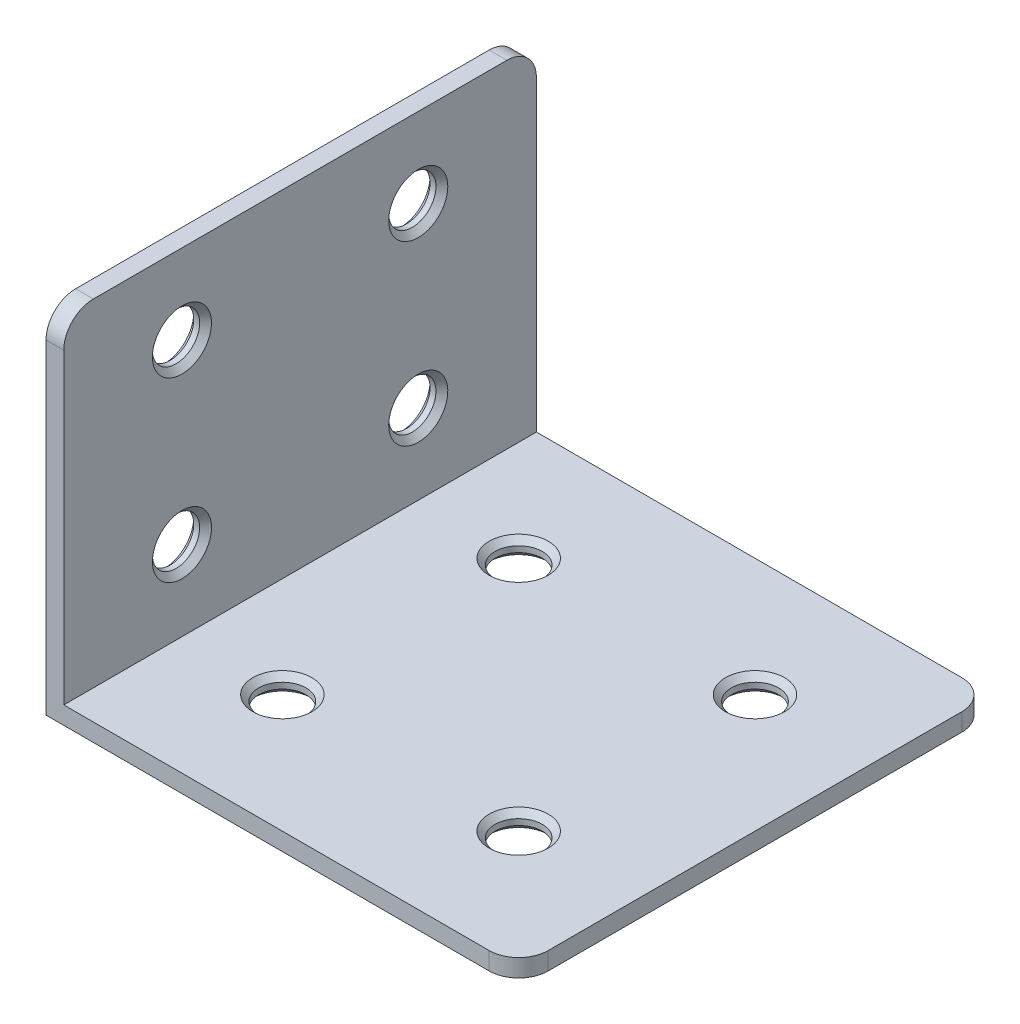
ISO-10303-21;
HEADER;
FILE_DESCRIPTION(('STEP AP214'),'2;1');
FILE_NAME('part.step','',(''),(''),'','','');
FILE_SCHEMA(('AUTOMOTIVE_DESIGN { 1 0 10303 214 1 1 1 1 }'));
ENDSEC;
DATA;
#1=APPLICATION_CONTEXT('core data for automotive mechanical design processes');
#2=APPLICATION_PROTOCOL_DEFINITION('international standard','automotive_design',2000,#1);
#3=PRODUCT_CONTEXT('',#1,'mechanical');
#4=PRODUCT('Part','Part','',(#3));
#5=PRODUCT_RELATED_PRODUCT_CATEGORY('part','',(#4));
#6=PRODUCT_DEFINITION_FORMATION('','',#4);
#7=PRODUCT_DEFINITION_CONTEXT('part definition',#1,'design');
#8=PRODUCT_DEFINITION('design','',#6,#7);
#9=PRODUCT_DEFINITION_SHAPE('','',#8);
#10=(LENGTH_UNIT() NAMED_UNIT(*) SI_UNIT(.MILLI.,.METRE.));
#11=(NAMED_UNIT(*) PLANE_ANGLE_UNIT() SI_UNIT($,.RADIAN.));
#12=(NAMED_UNIT(*) SI_UNIT($,.STERADIAN.) SOLID_ANGLE_UNIT());
#13=UNCERTAINTY_MEASURE_WITH_UNIT(LENGTH_MEASURE(1.E-05),#10,'distance_accuracy_value','');
#14=(GEOMETRIC_REPRESENTATION_CONTEXT(3) GLOBAL_UNCERTAINTY_ASSIGNED_CONTEXT((#13)) GLOBAL_UNIT_ASSIGNED_CONTEXT((#10,
#11,#12)) REPRESENTATION_CONTEXT('',''));
#15=CARTESIAN_POINT('',(0.,0.,0.));
#16=DIRECTION('',(0.,0.,1.));
#17=DIRECTION('',(1.,0.,0.));
#18=AXIS2_PLACEMENT_3D('',#15,#16,#17);
#19=CARTESIAN_POINT('',(0.,0.,0.));
#20=DIRECTION('',(0.,-1.,0.));
#21=DIRECTION('',(0.,0.,-1.));
#22=AXIS2_PLACEMENT_3D('',#19,#20,#21);
#23=PLANE('',#22);
#24=CARTESIAN_POINT('',(-20.,0.,-20.));
#25=DIRECTION('',(0.,-1.,0.));
#26=DIRECTION('',(0.,0.,-1.));
#27=AXIS2_PLACEMENT_3D('',#24,#25,#26);
#28=CIRCLE('',#27,5.);
#29=CARTESIAN_POINT('',(-20.,0.,-25.));
#30=VERTEX_POINT('',#29);
#31=EDGE_CURVE('E329',#30,#30,#28,.F.);
#32=ORIENTED_EDGE('',*,*,#31,.T.);
#33=EDGE_LOOP('',(#32));
#34=FACE_BOUND('',#33,.T.);
#35=CARTESIAN_POINT('',(20.,0.,20.));
#36=DIRECTION('',(0.,-1.,0.));
#37=DIRECTION('',(0.,0.,-1.));
#38=AXIS2_PLACEMENT_3D('',#35,#36,#37);
#39=CIRCLE('',#38,5.);
#40=CARTESIAN_POINT('',(20.,0.,15.));
#41=VERTEX_POINT('',#40);
#42=EDGE_CURVE('E325',#41,#41,#39,.F.);
#43=ORIENTED_EDGE('',*,*,#42,.T.);
#44=EDGE_LOOP('',(#43));
#45=FACE_BOUND('',#44,.T.);
#46=CARTESIAN_POINT('',(20.,0.,-20.));
#47=DIRECTION('',(0.,-1.,0.));
#48=DIRECTION('',(0.,0.,-1.));
#49=AXIS2_PLACEMENT_3D('',#46,#47,#48);
#50=CIRCLE('',#49,4.99999999999999);
#51=CARTESIAN_POINT('',(20.,0.,-25.));
#52=VERTEX_POINT('',#51);
#53=EDGE_CURVE('E321',#52,#52,#50,.F.);
#54=ORIENTED_EDGE('',*,*,#53,.T.);
#55=EDGE_LOOP('',(#54));
#56=FACE_BOUND('',#55,.T.);
#57=CARTESIAN_POINT('',(-20.,0.,20.));
#58=DIRECTION('',(0.,-1.,0.));
#59=DIRECTION('',(0.,0.,-1.));
#60=AXIS2_PLACEMENT_3D('',#57,#58,#59);
#61=CIRCLE('',#60,5.00000000000001);
#62=CARTESIAN_POINT('',(-20.,0.,15.));
#63=VERTEX_POINT('',#62);
#64=EDGE_CURVE('E317',#63,#63,#61,.F.);
#65=ORIENTED_EDGE('',*,*,#64,.T.);
#66=EDGE_LOOP('',(#65));
#67=FACE_BOUND('',#66,.T.);
#68=DIRECTION('',(0.,0.,-1.));
#69=VECTOR('',#68,1.);
#70=CARTESIAN_POINT('',(40.,0.,40.));
#71=LINE('',#70,#69);
#72=CARTESIAN_POINT('',(40.,0.,35.));
#73=VERTEX_POINT('',#72);
#74=CARTESIAN_POINT('',(40.,0.,-35.));
#75=VERTEX_POINT('',#74);
#76=EDGE_CURVE('E165',#73,#75,#71,.T.);
#77=ORIENTED_EDGE('',*,*,#76,.F.);
#78=CARTESIAN_POINT('',(35.,0.,35.));
#79=DIRECTION('',(0.,-1.,0.));
#80=DIRECTION('',(0.,0.,-1.));
#81=AXIS2_PLACEMENT_3D('',#78,#79,#80);
#82=CIRCLE('',#81,5.);
#83=CARTESIAN_POINT('',(35.,0.,40.));
#84=VERTEX_POINT('',#83);
#85=EDGE_CURVE('E201',#73,#84,#82,.T.);
#86=ORIENTED_EDGE('',*,*,#85,.T.);
#87=DIRECTION('',(1.,0.,0.));
#88=VECTOR('',#87,1.);
#89=CARTESIAN_POINT('',(-40.,0.,40.));
#90=LINE('',#89,#88);
#91=CARTESIAN_POINT('',(-40.,0.,40.));
#92=VERTEX_POINT('',#91);
#93=EDGE_CURVE('E171',#92,#84,#90,.T.);
#94=ORIENTED_EDGE('',*,*,#93,.F.);
#95=DIRECTION('',(0.,0.,1.));
#96=VECTOR('',#95,1.);
#97=CARTESIAN_POINT('',(-40.,0.,40.));
#98=LINE('',#97,#96);
#99=CARTESIAN_POINT('',(-40.,0.,-40.));
#100=VERTEX_POINT('',#99);
#101=EDGE_CURVE('E179',#100,#92,#98,.T.);
#102=ORIENTED_EDGE('',*,*,#101,.F.);
#103=DIRECTION('',(-1.,0.,0.));
#104=VECTOR('',#103,1.);
#105=CARTESIAN_POINT('',(-40.,0.,-40.));
#106=LINE('',#105,#104);
#107=CARTESIAN_POINT('',(35.,0.,-40.));
#108=VERTEX_POINT('',#107);
#109=EDGE_CURVE('E175',#108,#100,#106,.T.);
#110=ORIENTED_EDGE('',*,*,#109,.F.);
#111=CARTESIAN_POINT('',(35.,0.,-35.));
#112=DIRECTION('',(0.,-1.,0.));
#113=DIRECTION('',(0.,0.,-1.));
#114=AXIS2_PLACEMENT_3D('',#111,#112,#113);
#115=CIRCLE('',#114,5.);
#116=EDGE_CURVE('E198',#108,#75,#115,.T.);
#117=ORIENTED_EDGE('',*,*,#116,.T.);
#118=EDGE_LOOP('',(#77,#86,#94,#102,#110,#117));
#119=FACE_BOUND('',#118,.T.);
#120=ADVANCED_FACE('F41',(#34,#45,#56,#67,#119),#23,.T.);
#121=CARTESIAN_POINT('',(40.,3.,-40.));
#122=DIRECTION('',(0.,-1.,0.));
#123=DIRECTION('',(1.,0.,0.));
#124=AXIS2_PLACEMENT_3D('',#121,#122,#123);
#125=PLANE('',#124);
#126=CARTESIAN_POINT('',(-20.,2.99999999999999,-20.));
#127=DIRECTION('',(0.,-1.,0.));
#128=DIRECTION('',(1.,0.,0.));
#129=AXIS2_PLACEMENT_3D('',#126,#127,#128);
#130=CIRCLE('',#129,5.00000000000001);
#131=CARTESIAN_POINT('',(-15.,2.99999999999999,-20.));
#132=VERTEX_POINT('',#131);
#133=EDGE_CURVE('E313',#132,#132,#130,.T.);
#134=ORIENTED_EDGE('',*,*,#133,.T.);
#135=EDGE_LOOP('',(#134));
#136=FACE_BOUND('',#135,.T.);
#137=CARTESIAN_POINT('',(20.,3.,-20.));
#138=DIRECTION('',(0.,-1.,0.));
#139=DIRECTION('',(1.,0.,0.));
#140=AXIS2_PLACEMENT_3D('',#137,#138,#139);
#141=CIRCLE('',#140,5.00000000000002);
#142=CARTESIAN_POINT('',(25.,3.,-20.));
#143=VERTEX_POINT('',#142);
#144=EDGE_CURVE('E309',#143,#143,#141,.T.);
#145=ORIENTED_EDGE('',*,*,#144,.T.);
#146=EDGE_LOOP('',(#145));
#147=FACE_BOUND('',#146,.T.);
#148=CARTESIAN_POINT('',(20.,3.,20.));
#149=DIRECTION('',(0.,-1.,0.));
#150=DIRECTION('',(1.,0.,0.));
#151=AXIS2_PLACEMENT_3D('',#148,#149,#150);
#152=CIRCLE('',#151,5.00000000000001);
#153=CARTESIAN_POINT('',(25.,3.,20.));
#154=VERTEX_POINT('',#153);
#155=EDGE_CURVE('E305',#154,#154,#152,.T.);
#156=ORIENTED_EDGE('',*,*,#155,.T.);
#157=EDGE_LOOP('',(#156));
#158=FACE_BOUND('',#157,.T.);
#159=CARTESIAN_POINT('',(-20.,2.99999999999999,20.));
#160=DIRECTION('',(0.,-1.,0.));
#161=DIRECTION('',(1.,0.,0.));
#162=AXIS2_PLACEMENT_3D('',#159,#160,#161);
#163=CIRCLE('',#162,5.00000000000002);
#164=CARTESIAN_POINT('',(-15.,2.99999999999999,20.));
#165=VERTEX_POINT('',#164);
#166=EDGE_CURVE('E301',#165,#165,#163,.T.);
#167=ORIENTED_EDGE('',*,*,#166,.T.);
#168=EDGE_LOOP('',(#167));
#169=FACE_BOUND('',#168,.T.);
#170=DIRECTION('',(1.,0.,0.));
#171=VECTOR('',#170,1.);
#172=CARTESIAN_POINT('',(40.,3.,40.));
#173=LINE('',#172,#171);
#174=CARTESIAN_POINT('',(-37.,2.99999999999999,40.));
#175=VERTEX_POINT('',#174);
#176=CARTESIAN_POINT('',(35.,3.,40.));
#177=VERTEX_POINT('',#176);
#178=EDGE_CURVE('E135',#175,#177,#173,.T.);
#179=ORIENTED_EDGE('',*,*,#178,.T.);
#180=CARTESIAN_POINT('',(35.,3.,35.));
#181=DIRECTION('',(0.,-1.,0.));
#182=DIRECTION('',(1.,0.,0.));
#183=AXIS2_PLACEMENT_3D('',#180,#181,#182);
#184=CIRCLE('',#183,5.);
#185=CARTESIAN_POINT('',(40.,3.,35.));
#186=VERTEX_POINT('',#185);
#187=EDGE_CURVE('E212',#177,#186,#184,.F.);
#188=ORIENTED_EDGE('',*,*,#187,.T.);
#189=DIRECTION('',(0.,0.,1.));
#190=VECTOR('',#189,1.);
#191=CARTESIAN_POINT('',(40.,3.,-40.));
#192=LINE('',#191,#190);
#193=CARTESIAN_POINT('',(40.,3.,-35.));
#194=VERTEX_POINT('',#193);
#195=EDGE_CURVE('E146',#194,#186,#192,.T.);
#196=ORIENTED_EDGE('',*,*,#195,.F.);
#197=CARTESIAN_POINT('',(35.,3.,-35.));
#198=DIRECTION('',(0.,-1.,0.));
#199=DIRECTION('',(1.,0.,0.));
#200=AXIS2_PLACEMENT_3D('',#197,#198,#199);
#201=CIRCLE('',#200,5.);
#202=CARTESIAN_POINT('',(35.,3.,-40.));
#203=VERTEX_POINT('',#202);
#204=EDGE_CURVE('E152',#194,#203,#201,.F.);
#205=ORIENTED_EDGE('',*,*,#204,.T.);
#206=DIRECTION('',(1.,0.,0.));
#207=VECTOR('',#206,1.);
#208=CARTESIAN_POINT('',(40.,3.,-40.));
#209=LINE('',#208,#207);
#210=CARTESIAN_POINT('',(-37.,2.99999999999999,-40.));
#211=VERTEX_POINT('',#210);
#212=EDGE_CURVE('E128',#211,#203,#209,.T.);
#213=ORIENTED_EDGE('',*,*,#212,.F.);
#214=DIRECTION('',(0.,0.,1.));
#215=VECTOR('',#214,1.);
#216=CARTESIAN_POINT('',(-37.,2.99999999999999,-40.));
#217=LINE('',#216,#215);
#218=EDGE_CURVE('E138',#211,#175,#217,.T.);
#219=ORIENTED_EDGE('',*,*,#218,.T.);
#220=EDGE_LOOP('',(#179,#188,#196,#205,#213,#219));
#221=FACE_BOUND('',#220,.T.);
#222=ADVANCED_FACE('F149',(#136,#147,#158,#169,#221),#125,.F.);
#223=CARTESIAN_POINT('',(40.,60.,40.));
#224=DIRECTION('',(-1.,0.,0.));
#225=DIRECTION('',(0.,0.,1.));
#226=AXIS2_PLACEMENT_3D('',#223,#224,#225);
#227=PLANE('',#226);
#228=ORIENTED_EDGE('',*,*,#195,.T.);
#229=DIRECTION('',(0.,-1.,0.));
#230=VECTOR('',#229,1.);
#231=CARTESIAN_POINT('',(40.,60.,35.));
#232=LINE('',#231,#230);
#233=EDGE_CURVE('E194',#186,#73,#232,.T.);
#234=ORIENTED_EDGE('',*,*,#233,.T.);
#235=ORIENTED_EDGE('',*,*,#76,.T.);
#236=DIRECTION('',(0.,-1.,0.));
#237=VECTOR('',#236,1.);
#238=CARTESIAN_POINT('',(40.,60.,-35.));
#239=LINE('',#238,#237);
#240=EDGE_CURVE('E191',#75,#194,#239,.F.);
#241=ORIENTED_EDGE('',*,*,#240,.T.);
#242=EDGE_LOOP('',(#228,#234,#235,#241));
#243=FACE_BOUND('',#242,.T.);
#244=ADVANCED_FACE('F390',(#243),#227,.F.);
#245=CARTESIAN_POINT('',(-40.,60.,-40.));
#246=DIRECTION('',(0.,0.,1.));
#247=DIRECTION('',(1.,0.,0.));
#248=AXIS2_PLACEMENT_3D('',#245,#246,#247);
#249=PLANE('',#248);
#250=ORIENTED_EDGE('',*,*,#212,.T.);
#251=DIRECTION('',(0.,-1.,0.));
#252=VECTOR('',#251,1.);
#253=CARTESIAN_POINT('',(35.,60.,-40.));
#254=LINE('',#253,#252);
#255=EDGE_CURVE('E217',#203,#108,#254,.T.);
#256=ORIENTED_EDGE('',*,*,#255,.T.);
#257=ORIENTED_EDGE('',*,*,#109,.T.);
#258=DIRECTION('',(0.,-1.,0.));
#259=VECTOR('',#258,1.);
#260=CARTESIAN_POINT('',(-40.,60.,-40.));
#261=LINE('',#260,#259);
#262=CARTESIAN_POINT('',(-40.,55.,-40.));
#263=VERTEX_POINT('',#262);
#264=EDGE_CURVE('E188',#263,#100,#261,.T.);
#265=ORIENTED_EDGE('',*,*,#264,.F.);
#266=DIRECTION('',(-1.,0.,0.));
#267=VECTOR('',#266,1.);
#268=CARTESIAN_POINT('',(-40.,55.,-40.));
#269=LINE('',#268,#267);
#270=CARTESIAN_POINT('',(-37.,55.,-40.));
#271=VERTEX_POINT('',#270);
#272=EDGE_CURVE('E131',#263,#271,#269,.F.);
#273=ORIENTED_EDGE('',*,*,#272,.T.);
#274=DIRECTION('',(0.,-1.,0.));
#275=VECTOR('',#274,1.);
#276=CARTESIAN_POINT('',(-37.,60.,-40.));
#277=LINE('',#276,#275);
#278=EDGE_CURVE('E123',#271,#211,#277,.T.);
#279=ORIENTED_EDGE('',*,*,#278,.T.);
#280=EDGE_LOOP('',(#250,#256,#257,#265,#273,#279));
#281=FACE_BOUND('',#280,.T.);
#282=ADVANCED_FACE('F125',(#281),#249,.F.);
#283=CARTESIAN_POINT('',(-40.,60.,40.));
#284=DIRECTION('',(1.,0.,0.));
#285=DIRECTION('',(0.,0.,-1.));
#286=AXIS2_PLACEMENT_3D('',#283,#284,#285);
#287=PLANE('',#286);
#288=CARTESIAN_POINT('',(-40.,16.5,20.));
#289=DIRECTION('',(1.,0.,0.));
#290=DIRECTION('',(0.,0.,-1.));
#291=AXIS2_PLACEMENT_3D('',#288,#289,#290);
#292=CIRCLE('',#291,5.);
#293=CARTESIAN_POINT('',(-40.,16.5,15.));
#294=VERTEX_POINT('',#293);
#295=EDGE_CURVE('E249',#294,#294,#292,.T.);
#296=ORIENTED_EDGE('',*,*,#295,.T.);
#297=EDGE_LOOP('',(#296));
#298=FACE_BOUND('',#297,.T.);
#299=CARTESIAN_POINT('',(-40.,46.5,20.));
#300=DIRECTION('',(1.,0.,0.));
#301=DIRECTION('',(0.,0.,-1.));
#302=AXIS2_PLACEMENT_3D('',#299,#300,#301);
#303=CIRCLE('',#302,5.);
#304=CARTESIAN_POINT('',(-40.,46.5,15.));
#305=VERTEX_POINT('',#304);
#306=EDGE_CURVE('E245',#305,#305,#303,.T.);
#307=ORIENTED_EDGE('',*,*,#306,.T.);
#308=EDGE_LOOP('',(#307));
#309=FACE_BOUND('',#308,.T.);
#310=CARTESIAN_POINT('',(-40.,46.5,-20.));
#311=DIRECTION('',(1.,0.,0.));
#312=DIRECTION('',(0.,0.,-1.));
#313=AXIS2_PLACEMENT_3D('',#310,#311,#312);
#314=CIRCLE('',#313,5.);
#315=CARTESIAN_POINT('',(-40.,46.5,-25.));
#316=VERTEX_POINT('',#315);
#317=EDGE_CURVE('E241',#316,#316,#314,.T.);
#318=ORIENTED_EDGE('',*,*,#317,.T.);
#319=EDGE_LOOP('',(#318));
#320=FACE_BOUND('',#319,.T.);
#321=CARTESIAN_POINT('',(-40.,16.5,-20.));
#322=DIRECTION('',(1.,0.,0.));
#323=DIRECTION('',(0.,0.,-1.));
#324=AXIS2_PLACEMENT_3D('',#321,#322,#323);
#325=CIRCLE('',#324,5.);
#326=CARTESIAN_POINT('',(-40.,16.5,-25.));
#327=VERTEX_POINT('',#326);
#328=EDGE_CURVE('E237',#327,#327,#325,.T.);
#329=ORIENTED_EDGE('',*,*,#328,.T.);
#330=EDGE_LOOP('',(#329));
#331=FACE_BOUND('',#330,.T.);
#332=DIRECTION('',(0.,0.,1.));
#333=VECTOR('',#332,1.);
#334=CARTESIAN_POINT('',(-40.,60.,40.));
#335=LINE('',#334,#333);
#336=CARTESIAN_POINT('',(-40.,60.,-35.));
#337=VERTEX_POINT('',#336);
#338=CARTESIAN_POINT('',(-40.,60.,35.));
#339=VERTEX_POINT('',#338);
#340=EDGE_CURVE('E167',#337,#339,#335,.T.);
#341=ORIENTED_EDGE('',*,*,#340,.F.);
#342=CARTESIAN_POINT('',(-40.,55.,-35.));
#343=DIRECTION('',(1.,0.,0.));
#344=DIRECTION('',(0.,0.,-1.));
#345=AXIS2_PLACEMENT_3D('',#342,#343,#344);
#346=CIRCLE('',#345,5.);
#347=EDGE_CURVE('E66',#337,#263,#346,.F.);
#348=ORIENTED_EDGE('',*,*,#347,.T.);
#349=ORIENTED_EDGE('',*,*,#264,.T.);
#350=ORIENTED_EDGE('',*,*,#101,.T.);
#351=DIRECTION('',(0.,-1.,0.));
#352=VECTOR('',#351,1.);
#353=CARTESIAN_POINT('',(-40.,60.,40.));
#354=LINE('',#353,#352);
#355=CARTESIAN_POINT('',(-40.,55.,40.));
#356=VERTEX_POINT('',#355);
#357=EDGE_CURVE('E170',#356,#92,#354,.T.);
#358=ORIENTED_EDGE('',*,*,#357,.F.);
#359=CARTESIAN_POINT('',(-40.,55.,35.));
#360=DIRECTION('',(1.,0.,0.));
#361=DIRECTION('',(0.,0.,-1.));
#362=AXIS2_PLACEMENT_3D('',#359,#360,#361);
#363=CIRCLE('',#362,5.);
#364=EDGE_CURVE('E58',#356,#339,#363,.F.);
#365=ORIENTED_EDGE('',*,*,#364,.T.);
#366=EDGE_LOOP('',(#341,#348,#349,#350,#358,#365));
#367=FACE_BOUND('',#366,.T.);
#368=ADVANCED_FACE('F370',(#298,#309,#320,#331,#367),#287,.F.);
#369=CARTESIAN_POINT('',(-40.,60.,40.));
#370=DIRECTION('',(0.,0.,-1.));
#371=DIRECTION('',(-1.,0.,0.));
#372=AXIS2_PLACEMENT_3D('',#369,#370,#371);
#373=PLANE('',#372);
#374=ORIENTED_EDGE('',*,*,#93,.T.);
#375=DIRECTION('',(0.,-1.,0.));
#376=VECTOR('',#375,1.);
#377=CARTESIAN_POINT('',(35.,60.,40.));
#378=LINE('',#377,#376);
#379=EDGE_CURVE('E207',#84,#177,#378,.F.);
#380=ORIENTED_EDGE('',*,*,#379,.T.);
#381=ORIENTED_EDGE('',*,*,#178,.F.);
#382=DIRECTION('',(0.,-1.,0.));
#383=VECTOR('',#382,1.);
#384=CARTESIAN_POINT('',(-37.,60.,40.));
#385=LINE('',#384,#383);
#386=CARTESIAN_POINT('',(-37.,55.,40.));
#387=VERTEX_POINT('',#386);
#388=EDGE_CURVE('E141',#387,#175,#385,.T.);
#389=ORIENTED_EDGE('',*,*,#388,.F.);
#390=DIRECTION('',(1.,0.,0.));
#391=VECTOR('',#390,1.);
#392=CARTESIAN_POINT('',(-40.,55.,40.));
#393=LINE('',#392,#391);
#394=EDGE_CURVE('E204',#387,#356,#393,.F.);
#395=ORIENTED_EDGE('',*,*,#394,.T.);
#396=ORIENTED_EDGE('',*,*,#357,.T.);
#397=EDGE_LOOP('',(#374,#380,#381,#389,#395,#396));
#398=FACE_BOUND('',#397,.T.);
#399=ADVANCED_FACE('F372',(#398),#373,.F.);
#400=CARTESIAN_POINT('',(0.,60.,0.));
#401=DIRECTION('',(0.,-1.,0.));
#402=DIRECTION('',(0.,0.,-1.));
#403=AXIS2_PLACEMENT_3D('',#400,#401,#402);
#404=PLANE('',#403);
#405=DIRECTION('',(0.,0.,1.));
#406=VECTOR('',#405,1.);
#407=CARTESIAN_POINT('',(-37.,60.,-40.));
#408=LINE('',#407,#406);
#409=CARTESIAN_POINT('',(-37.,60.,-35.));
#410=VERTEX_POINT('',#409);
#411=CARTESIAN_POINT('',(-37.,60.,35.));
#412=VERTEX_POINT('',#411);
#413=EDGE_CURVE('E147',#410,#412,#408,.T.);
#414=ORIENTED_EDGE('',*,*,#413,.F.);
#415=DIRECTION('',(-1.,0.,0.));
#416=VECTOR('',#415,1.);
#417=CARTESIAN_POINT('',(0.,60.,-35.));
#418=LINE('',#417,#416);
#419=EDGE_CURVE('E224',#410,#337,#418,.T.);
#420=ORIENTED_EDGE('',*,*,#419,.T.);
#421=ORIENTED_EDGE('',*,*,#340,.T.);
#422=DIRECTION('',(1.,0.,0.));
#423=VECTOR('',#422,1.);
#424=CARTESIAN_POINT('',(0.,60.,35.));
#425=LINE('',#424,#423);
#426=EDGE_CURVE('E220',#339,#412,#425,.T.);
#427=ORIENTED_EDGE('',*,*,#426,.T.);
#428=EDGE_LOOP('',(#414,#420,#421,#427));
#429=FACE_BOUND('',#428,.T.);
#430=ADVANCED_FACE('F378',(#429),#404,.F.);
#431=CARTESIAN_POINT('',(-37.,60.,-40.));
#432=DIRECTION('',(-1.,0.,0.));
#433=DIRECTION('',(0.,-1.,0.));
#434=AXIS2_PLACEMENT_3D('',#431,#432,#433);
#435=PLANE('',#434);
#436=CARTESIAN_POINT('',(-37.,16.5,20.));
#437=DIRECTION('',(-1.,0.,0.));
#438=DIRECTION('',(0.,-1.,0.));
#439=AXIS2_PLACEMENT_3D('',#436,#437,#438);
#440=CIRCLE('',#439,4.99999999999997);
#441=CARTESIAN_POINT('',(-37.,11.5,20.));
#442=VERTEX_POINT('',#441);
#443=EDGE_CURVE('E273',#442,#442,#440,.T.);
#444=ORIENTED_EDGE('',*,*,#443,.T.);
#445=EDGE_LOOP('',(#444));
#446=FACE_BOUND('',#445,.T.);
#447=CARTESIAN_POINT('',(-37.,46.5,20.));
#448=DIRECTION('',(-1.,0.,0.));
#449=DIRECTION('',(0.,-1.,0.));
#450=AXIS2_PLACEMENT_3D('',#447,#448,#449);
#451=CIRCLE('',#450,4.99999999999997);
#452=CARTESIAN_POINT('',(-37.,41.5,20.));
#453=VERTEX_POINT('',#452);
#454=EDGE_CURVE('E269',#453,#453,#451,.T.);
#455=ORIENTED_EDGE('',*,*,#454,.T.);
#456=EDGE_LOOP('',(#455));
#457=FACE_BOUND('',#456,.T.);
#458=CARTESIAN_POINT('',(-37.,46.5,-20.));
#459=DIRECTION('',(-1.,0.,0.));
#460=DIRECTION('',(0.,-1.,0.));
#461=AXIS2_PLACEMENT_3D('',#458,#459,#460);
#462=CIRCLE('',#461,4.99999999999998);
#463=CARTESIAN_POINT('',(-37.,41.5,-20.));
#464=VERTEX_POINT('',#463);
#465=EDGE_CURVE('E265',#464,#464,#462,.T.);
#466=ORIENTED_EDGE('',*,*,#465,.T.);
#467=EDGE_LOOP('',(#466));
#468=FACE_BOUND('',#467,.T.);
#469=CARTESIAN_POINT('',(-37.,16.5,-20.));
#470=DIRECTION('',(-1.,0.,0.));
#471=DIRECTION('',(0.,-1.,0.));
#472=AXIS2_PLACEMENT_3D('',#469,#470,#471);
#473=CIRCLE('',#472,4.99999999999997);
#474=CARTESIAN_POINT('',(-37.,11.5,-20.));
#475=VERTEX_POINT('',#474);
#476=EDGE_CURVE('E261',#475,#475,#473,.T.);
#477=ORIENTED_EDGE('',*,*,#476,.T.);
#478=EDGE_LOOP('',(#477));
#479=FACE_BOUND('',#478,.T.);
#480=ORIENTED_EDGE('',*,*,#278,.F.);
#481=CARTESIAN_POINT('',(-37.,55.,-35.));
#482=DIRECTION('',(-1.,0.,0.));
#483=DIRECTION('',(0.,-1.,0.));
#484=AXIS2_PLACEMENT_3D('',#481,#482,#483);
#485=CIRCLE('',#484,5.);
#486=EDGE_CURVE('E234',#271,#410,#485,.F.);
#487=ORIENTED_EDGE('',*,*,#486,.T.);
#488=ORIENTED_EDGE('',*,*,#413,.T.);
#489=CARTESIAN_POINT('',(-37.,55.,35.));
#490=DIRECTION('',(-1.,0.,0.));
#491=DIRECTION('',(0.,-1.,0.));
#492=AXIS2_PLACEMENT_3D('',#489,#490,#491);
#493=CIRCLE('',#492,5.);
#494=EDGE_CURVE('E231',#412,#387,#493,.F.);
#495=ORIENTED_EDGE('',*,*,#494,.T.);
#496=ORIENTED_EDGE('',*,*,#388,.T.);
#497=ORIENTED_EDGE('',*,*,#218,.F.);
#498=EDGE_LOOP('',(#480,#487,#488,#495,#496,#497));
#499=FACE_BOUND('',#498,.T.);
#500=ADVANCED_FACE('F139',(#446,#457,#468,#479,#499),#435,.F.);
#501=CARTESIAN_POINT('',(20.,0.,20.));
#502=DIRECTION('',(0.,1.,0.));
#503=DIRECTION('',(-1.,0.,0.));
#504=AXIS2_PLACEMENT_3D('',#501,#502,#503);
#505=CYLINDRICAL_SURFACE('',#504,4.);
#506=CARTESIAN_POINT('',(20.,0.999999999999992,20.));
#507=DIRECTION('',(0.,-1.,0.));
#508=DIRECTION('',(0.,0.,-1.));
#509=AXIS2_PLACEMENT_3D('',#506,#507,#508);
#510=CIRCLE('',#509,4.);
#511=CARTESIAN_POINT('',(20.,0.999999999999992,16.));
#512=VERTEX_POINT('',#511);
#513=EDGE_CURVE('E337',#512,#512,#510,.T.);
#514=ORIENTED_EDGE('',*,*,#513,.T.);
#515=EDGE_LOOP('',(#514));
#516=FACE_BOUND('',#515,.T.);
#517=CARTESIAN_POINT('',(20.,1.99999999999999,20.));
#518=DIRECTION('',(0.,-1.,0.));
#519=DIRECTION('',(0.,0.,-1.));
#520=AXIS2_PLACEMENT_3D('',#517,#518,#519);
#521=CIRCLE('',#520,4.);
#522=CARTESIAN_POINT('',(20.,1.99999999999999,16.));
#523=VERTEX_POINT('',#522);
#524=EDGE_CURVE('E333',#523,#523,#521,.F.);
#525=ORIENTED_EDGE('',*,*,#524,.T.);
#526=EDGE_LOOP('',(#525));
#527=FACE_BOUND('',#526,.T.);
#528=ADVANCED_FACE('F451',(#516,#527),#505,.F.);
#529=CARTESIAN_POINT('',(20.,0.,-20.));
#530=DIRECTION('',(0.,1.,0.));
#531=DIRECTION('',(-1.,0.,0.));
#532=AXIS2_PLACEMENT_3D('',#529,#530,#531);
#533=CYLINDRICAL_SURFACE('',#532,4.);
#534=CARTESIAN_POINT('',(20.,0.999999999999992,-20.));
#535=DIRECTION('',(0.,-1.,0.));
#536=DIRECTION('',(0.,0.,-1.));
#537=AXIS2_PLACEMENT_3D('',#534,#535,#536);
#538=CIRCLE('',#537,4.);
#539=CARTESIAN_POINT('',(20.,0.999999999999992,-24.));
#540=VERTEX_POINT('',#539);
#541=EDGE_CURVE('E345',#540,#540,#538,.T.);
#542=ORIENTED_EDGE('',*,*,#541,.T.);
#543=EDGE_LOOP('',(#542));
#544=FACE_BOUND('',#543,.T.);
#545=CARTESIAN_POINT('',(20.,1.99999999999999,-20.));
#546=DIRECTION('',(0.,-1.,0.));
#547=DIRECTION('',(0.,0.,-1.));
#548=AXIS2_PLACEMENT_3D('',#545,#546,#547);
#549=CIRCLE('',#548,4.);
#550=CARTESIAN_POINT('',(20.,1.99999999999999,-24.));
#551=VERTEX_POINT('',#550);
#552=EDGE_CURVE('E341',#551,#551,#549,.F.);
#553=ORIENTED_EDGE('',*,*,#552,.T.);
#554=EDGE_LOOP('',(#553));
#555=FACE_BOUND('',#554,.T.);
#556=ADVANCED_FACE('F447',(#544,#555),#533,.F.);
#557=CARTESIAN_POINT('',(-20.,0.,-20.));
#558=DIRECTION('',(0.,1.,0.));
#559=DIRECTION('',(-1.,0.,0.));
#560=AXIS2_PLACEMENT_3D('',#557,#558,#559);
#561=CYLINDRICAL_SURFACE('',#560,4.);
#562=CARTESIAN_POINT('',(-20.,1.99999999999999,-20.));
#563=DIRECTION('',(0.,-1.,0.));
#564=DIRECTION('',(0.,0.,-1.));
#565=AXIS2_PLACEMENT_3D('',#562,#563,#564);
#566=CIRCLE('',#565,4.);
#567=CARTESIAN_POINT('',(-20.,1.99999999999999,-24.));
#568=VERTEX_POINT('',#567);
#569=EDGE_CURVE('E297',#568,#568,#566,.F.);
#570=ORIENTED_EDGE('',*,*,#569,.T.);
#571=EDGE_LOOP('',(#570));
#572=FACE_BOUND('',#571,.T.);
#573=CARTESIAN_POINT('',(-20.,0.999999999999992,-20.));
#574=DIRECTION('',(0.,-1.,0.));
#575=DIRECTION('',(0.,0.,-1.));
#576=AXIS2_PLACEMENT_3D('',#573,#574,#575);
#577=CIRCLE('',#576,4.);
#578=CARTESIAN_POINT('',(-20.,0.999999999999992,-24.));
#579=VERTEX_POINT('',#578);
#580=EDGE_CURVE('E293',#579,#579,#577,.T.);
#581=ORIENTED_EDGE('',*,*,#580,.T.);
#582=EDGE_LOOP('',(#581));
#583=FACE_BOUND('',#582,.T.);
#584=ADVANCED_FACE('F450',(#572,#583),#561,.F.);
#585=CARTESIAN_POINT('',(-20.,0.,20.));
#586=DIRECTION('',(0.,1.,0.));
#587=DIRECTION('',(-1.,0.,0.));
#588=AXIS2_PLACEMENT_3D('',#585,#586,#587);
#589=CYLINDRICAL_SURFACE('',#588,4.);
#590=CARTESIAN_POINT('',(-20.,1.00000000000001,20.));
#591=DIRECTION('',(0.,-1.,0.));
#592=DIRECTION('',(0.,0.,-1.));
#593=AXIS2_PLACEMENT_3D('',#590,#591,#592);
#594=CIRCLE('',#593,4.);
#595=CARTESIAN_POINT('',(-20.,1.00000000000001,16.));
#596=VERTEX_POINT('',#595);
#597=EDGE_CURVE('E353',#596,#596,#594,.T.);
#598=ORIENTED_EDGE('',*,*,#597,.T.);
#599=EDGE_LOOP('',(#598));
#600=FACE_BOUND('',#599,.T.);
#601=CARTESIAN_POINT('',(-20.,1.99999999999999,20.));
#602=DIRECTION('',(0.,-1.,0.));
#603=DIRECTION('',(0.,0.,-1.));
#604=AXIS2_PLACEMENT_3D('',#601,#602,#603);
#605=CIRCLE('',#604,4.);
#606=CARTESIAN_POINT('',(-20.,1.99999999999999,16.));
#607=VERTEX_POINT('',#606);
#608=EDGE_CURVE('E349',#607,#607,#605,.F.);
#609=ORIENTED_EDGE('',*,*,#608,.T.);
#610=EDGE_LOOP('',(#609));
#611=FACE_BOUND('',#610,.T.);
#612=ADVANCED_FACE('F445',(#600,#611),#589,.F.);
#613=CARTESIAN_POINT('',(-97.,46.5,20.));
#614=DIRECTION('',(1.,0.,0.));
#615=DIRECTION('',(0.,1.,0.));
#616=AXIS2_PLACEMENT_3D('',#613,#614,#615);
#617=CYLINDRICAL_SURFACE('',#616,4.);
#618=CARTESIAN_POINT('',(-39.,46.5,20.));
#619=DIRECTION('',(1.,0.,0.));
#620=DIRECTION('',(0.,0.,-1.));
#621=AXIS2_PLACEMENT_3D('',#618,#619,#620);
#622=CIRCLE('',#621,4.);
#623=CARTESIAN_POINT('',(-39.,46.5,16.));
#624=VERTEX_POINT('',#623);
#625=EDGE_CURVE('E281',#624,#624,#622,.F.);
#626=ORIENTED_EDGE('',*,*,#625,.T.);
#627=EDGE_LOOP('',(#626));
#628=FACE_BOUND('',#627,.T.);
#629=CARTESIAN_POINT('',(-38.,46.5,20.));
#630=DIRECTION('',(-1.,0.,0.));
#631=DIRECTION('',(0.,0.,1.));
#632=AXIS2_PLACEMENT_3D('',#629,#630,#631);
#633=CIRCLE('',#632,4.);
#634=CARTESIAN_POINT('',(-38.,46.5,24.));
#635=VERTEX_POINT('',#634);
#636=EDGE_CURVE('E277',#635,#635,#633,.F.);
#637=ORIENTED_EDGE('',*,*,#636,.T.);
#638=EDGE_LOOP('',(#637));
#639=FACE_BOUND('',#638,.T.);
#640=ADVANCED_FACE('F442',(#628,#639),#617,.F.);
#641=CARTESIAN_POINT('',(-97.,16.5,20.));
#642=DIRECTION('',(1.,0.,0.));
#643=DIRECTION('',(0.,1.,0.));
#644=AXIS2_PLACEMENT_3D('',#641,#642,#643);
#645=CYLINDRICAL_SURFACE('',#644,4.);
#646=CARTESIAN_POINT('',(-39.,16.5,20.));
#647=DIRECTION('',(1.,0.,0.));
#648=DIRECTION('',(0.,0.,-1.));
#649=AXIS2_PLACEMENT_3D('',#646,#647,#648);
#650=CIRCLE('',#649,4.);
#651=CARTESIAN_POINT('',(-39.,16.5,16.));
#652=VERTEX_POINT('',#651);
#653=EDGE_CURVE('E257',#652,#652,#650,.F.);
#654=ORIENTED_EDGE('',*,*,#653,.T.);
#655=EDGE_LOOP('',(#654));
#656=FACE_BOUND('',#655,.T.);
#657=CARTESIAN_POINT('',(-37.9999999999999,16.5,20.));
#658=DIRECTION('',(-1.,0.,0.));
#659=DIRECTION('',(0.,0.,1.));
#660=AXIS2_PLACEMENT_3D('',#657,#658,#659);
#661=CIRCLE('',#660,4.);
#662=CARTESIAN_POINT('',(-37.9999999999999,16.5,24.));
#663=VERTEX_POINT('',#662);
#664=EDGE_CURVE('E253',#663,#663,#661,.F.);
#665=ORIENTED_EDGE('',*,*,#664,.T.);
#666=EDGE_LOOP('',(#665));
#667=FACE_BOUND('',#666,.T.);
#668=ADVANCED_FACE('F436',(#656,#667),#645,.F.);
#669=CARTESIAN_POINT('',(-97.,16.5,-20.));
#670=DIRECTION('',(1.,0.,0.));
#671=DIRECTION('',(0.,1.,0.));
#672=AXIS2_PLACEMENT_3D('',#669,#670,#671);
#673=CYLINDRICAL_SURFACE('',#672,4.);
#674=CARTESIAN_POINT('',(-37.9999999999999,16.5,-20.));
#675=DIRECTION('',(-1.,0.,0.));
#676=DIRECTION('',(0.,0.,1.));
#677=AXIS2_PLACEMENT_3D('',#674,#675,#676);
#678=CIRCLE('',#677,4.);
#679=CARTESIAN_POINT('',(-37.9999999999999,16.5,-16.));
#680=VERTEX_POINT('',#679);
#681=EDGE_CURVE('E11',#680,#680,#678,.F.);
#682=ORIENTED_EDGE('',*,*,#681,.T.);
#683=EDGE_LOOP('',(#682));
#684=FACE_BOUND('',#683,.T.);
#685=CARTESIAN_POINT('',(-39.,16.5,-20.));
#686=DIRECTION('',(1.,0.,0.));
#687=DIRECTION('',(0.,0.,-1.));
#688=AXIS2_PLACEMENT_3D('',#685,#686,#687);
#689=CIRCLE('',#688,4.);
#690=CARTESIAN_POINT('',(-39.,16.5,-24.));
#691=VERTEX_POINT('',#690);
#692=EDGE_CURVE('E51',#691,#691,#689,.F.);
#693=ORIENTED_EDGE('',*,*,#692,.T.);
#694=EDGE_LOOP('',(#693));
#695=FACE_BOUND('',#694,.T.);
#696=ADVANCED_FACE('F360',(#684,#695),#673,.F.);
#697=CARTESIAN_POINT('',(-97.,46.5,-20.));
#698=DIRECTION('',(1.,0.,0.));
#699=DIRECTION('',(0.,1.,0.));
#700=AXIS2_PLACEMENT_3D('',#697,#698,#699);
#701=CYLINDRICAL_SURFACE('',#700,4.);
#702=CARTESIAN_POINT('',(-39.,46.5,-20.));
#703=DIRECTION('',(1.,0.,0.));
#704=DIRECTION('',(0.,0.,-1.));
#705=AXIS2_PLACEMENT_3D('',#702,#703,#704);
#706=CIRCLE('',#705,4.);
#707=CARTESIAN_POINT('',(-39.,46.5,-24.));
#708=VERTEX_POINT('',#707);
#709=EDGE_CURVE('E289',#708,#708,#706,.F.);
#710=ORIENTED_EDGE('',*,*,#709,.T.);
#711=EDGE_LOOP('',(#710));
#712=FACE_BOUND('',#711,.T.);
#713=CARTESIAN_POINT('',(-38.,46.5,-20.));
#714=DIRECTION('',(-1.,0.,0.));
#715=DIRECTION('',(0.,0.,1.));
#716=AXIS2_PLACEMENT_3D('',#713,#714,#715);
#717=CIRCLE('',#716,4.);
#718=CARTESIAN_POINT('',(-38.,46.5,-16.));
#719=VERTEX_POINT('',#718);
#720=EDGE_CURVE('E285',#719,#719,#717,.F.);
#721=ORIENTED_EDGE('',*,*,#720,.T.);
#722=EDGE_LOOP('',(#721));
#723=FACE_BOUND('',#722,.T.);
#724=ADVANCED_FACE('F427',(#712,#723),#701,.F.);
#725=CARTESIAN_POINT('',(35.,60.,35.));
#726=DIRECTION('',(0.,-1.,0.));
#727=DIRECTION('',(0.,0.,-1.));
#728=AXIS2_PLACEMENT_3D('',#725,#726,#727);
#729=CYLINDRICAL_SURFACE('',#728,5.);
#730=ORIENTED_EDGE('',*,*,#187,.F.);
#731=ORIENTED_EDGE('',*,*,#379,.F.);
#732=ORIENTED_EDGE('',*,*,#85,.F.);
#733=ORIENTED_EDGE('',*,*,#233,.F.);
#734=EDGE_LOOP('',(#730,#731,#732,#733));
#735=FACE_BOUND('',#734,.T.);
#736=ADVANCED_FACE('F387',(#735),#729,.T.);
#737=CARTESIAN_POINT('',(35.,60.,-35.));
#738=DIRECTION('',(0.,-1.,0.));
#739=DIRECTION('',(0.,0.,-1.));
#740=AXIS2_PLACEMENT_3D('',#737,#738,#739);
#741=CYLINDRICAL_SURFACE('',#740,5.);
#742=ORIENTED_EDGE('',*,*,#204,.F.);
#743=ORIENTED_EDGE('',*,*,#240,.F.);
#744=ORIENTED_EDGE('',*,*,#116,.F.);
#745=ORIENTED_EDGE('',*,*,#255,.F.);
#746=EDGE_LOOP('',(#742,#743,#744,#745));
#747=FACE_BOUND('',#746,.T.);
#748=ADVANCED_FACE('F397',(#747),#741,.T.);
#749=CARTESIAN_POINT('',(0.,55.,-35.));
#750=DIRECTION('',(-1.,0.,0.));
#751=DIRECTION('',(0.,0.,1.));
#752=AXIS2_PLACEMENT_3D('',#749,#750,#751);
#753=CYLINDRICAL_SURFACE('',#752,5.);
#754=ORIENTED_EDGE('',*,*,#486,.F.);
#755=ORIENTED_EDGE('',*,*,#272,.F.);
#756=ORIENTED_EDGE('',*,*,#347,.F.);
#757=ORIENTED_EDGE('',*,*,#419,.F.);
#758=EDGE_LOOP('',(#754,#755,#756,#757));
#759=FACE_BOUND('',#758,.T.);
#760=ADVANCED_FACE('F398',(#759),#753,.T.);
#761=CARTESIAN_POINT('',(0.,55.,35.));
#762=DIRECTION('',(1.,0.,0.));
#763=DIRECTION('',(0.,0.,-1.));
#764=AXIS2_PLACEMENT_3D('',#761,#762,#763);
#765=CYLINDRICAL_SURFACE('',#764,5.);
#766=ORIENTED_EDGE('',*,*,#364,.F.);
#767=ORIENTED_EDGE('',*,*,#394,.F.);
#768=ORIENTED_EDGE('',*,*,#494,.F.);
#769=ORIENTED_EDGE('',*,*,#426,.F.);
#770=EDGE_LOOP('',(#766,#767,#768,#769));
#771=FACE_BOUND('',#770,.T.);
#772=ADVANCED_FACE('F380',(#771),#765,.T.);
#773=CARTESIAN_POINT('',(-40.,16.5,20.));
#774=DIRECTION('',(-1.,0.,0.));
#775=DIRECTION('',(0.,0.,1.));
#776=AXIS2_PLACEMENT_3D('',#773,#774,#775);
#777=CONICAL_SURFACE('',#776,5.,0.785398163397447);
#778=ORIENTED_EDGE('',*,*,#653,.F.);
#779=EDGE_LOOP('',(#778));
#780=FACE_BOUND('',#779,.T.);
#781=ORIENTED_EDGE('',*,*,#295,.F.);
#782=EDGE_LOOP('',(#781));
#783=FACE_BOUND('',#782,.T.);
#784=ADVANCED_FACE('F405',(#780,#783),#777,.F.);
#785=CARTESIAN_POINT('',(-37.9999999999999,16.5,20.));
#786=DIRECTION('',(1.,0.,0.));
#787=DIRECTION('',(0.,0.,-1.));
#788=AXIS2_PLACEMENT_3D('',#785,#786,#787);
#789=CONICAL_SURFACE('',#788,4.,0.785398163397464);
#790=ORIENTED_EDGE('',*,*,#443,.F.);
#791=EDGE_LOOP('',(#790));
#792=FACE_BOUND('',#791,.T.);
#793=ORIENTED_EDGE('',*,*,#664,.F.);
#794=EDGE_LOOP('',(#793));
#795=FACE_BOUND('',#794,.T.);
#796=ADVANCED_FACE('F625',(#792,#795),#789,.F.);
#797=CARTESIAN_POINT('',(-40.,46.5,20.));
#798=DIRECTION('',(-1.,0.,0.));
#799=DIRECTION('',(0.,0.,1.));
#800=AXIS2_PLACEMENT_3D('',#797,#798,#799);
#801=CONICAL_SURFACE('',#800,5.,0.78539816339745);
#802=ORIENTED_EDGE('',*,*,#625,.F.);
#803=EDGE_LOOP('',(#802));
#804=FACE_BOUND('',#803,.T.);
#805=ORIENTED_EDGE('',*,*,#306,.F.);
#806=EDGE_LOOP('',(#805));
#807=FACE_BOUND('',#806,.T.);
#808=ADVANCED_FACE('F615',(#804,#807),#801,.F.);
#809=CARTESIAN_POINT('',(-38.,46.5,20.));
#810=DIRECTION('',(1.,0.,0.));
#811=DIRECTION('',(0.,0.,-1.));
#812=AXIS2_PLACEMENT_3D('',#809,#810,#811);
#813=CONICAL_SURFACE('',#812,4.,0.785398163397461);
#814=ORIENTED_EDGE('',*,*,#454,.F.);
#815=EDGE_LOOP('',(#814));
#816=FACE_BOUND('',#815,.T.);
#817=ORIENTED_EDGE('',*,*,#636,.F.);
#818=EDGE_LOOP('',(#817));
#819=FACE_BOUND('',#818,.T.);
#820=ADVANCED_FACE('F605',(#816,#819),#813,.F.);
#821=CARTESIAN_POINT('',(-40.,46.5,-20.));
#822=DIRECTION('',(-1.,0.,0.));
#823=DIRECTION('',(0.,0.,1.));
#824=AXIS2_PLACEMENT_3D('',#821,#822,#823);
#825=CONICAL_SURFACE('',#824,5.,0.78539816339745);
#826=ORIENTED_EDGE('',*,*,#709,.F.);
#827=EDGE_LOOP('',(#826));
#828=FACE_BOUND('',#827,.T.);
#829=ORIENTED_EDGE('',*,*,#317,.F.);
#830=EDGE_LOOP('',(#829));
#831=FACE_BOUND('',#830,.T.);
#832=ADVANCED_FACE('F595',(#828,#831),#825,.F.);
#833=CARTESIAN_POINT('',(-38.,46.5,-20.));
#834=DIRECTION('',(1.,0.,0.));
#835=DIRECTION('',(0.,0.,-1.));
#836=AXIS2_PLACEMENT_3D('',#833,#834,#835);
#837=CONICAL_SURFACE('',#836,4.,0.785398163397463);
#838=ORIENTED_EDGE('',*,*,#465,.F.);
#839=EDGE_LOOP('',(#838));
#840=FACE_BOUND('',#839,.T.);
#841=ORIENTED_EDGE('',*,*,#720,.F.);
#842=EDGE_LOOP('',(#841));
#843=FACE_BOUND('',#842,.T.);
#844=ADVANCED_FACE('F585',(#840,#843),#837,.F.);
#845=CARTESIAN_POINT('',(-20.,1.99999999999999,-20.));
#846=DIRECTION('',(0.,1.,0.));
#847=DIRECTION('',(0.,0.,1.));
#848=AXIS2_PLACEMENT_3D('',#845,#846,#847);
#849=CONICAL_SURFACE('',#848,4.,0.78539816339745);
#850=ORIENTED_EDGE('',*,*,#133,.F.);
#851=EDGE_LOOP('',(#850));
#852=FACE_BOUND('',#851,.T.);
#853=ORIENTED_EDGE('',*,*,#569,.F.);
#854=EDGE_LOOP('',(#853));
#855=FACE_BOUND('',#854,.T.);
#856=ADVANCED_FACE('F575',(#852,#855),#849,.F.);
#857=CARTESIAN_POINT('',(-20.,0.,-20.));
#858=DIRECTION('',(0.,-1.,0.));
#859=DIRECTION('',(0.,0.,-1.));
#860=AXIS2_PLACEMENT_3D('',#857,#858,#859);
#861=CONICAL_SURFACE('',#860,5.,0.785398163397454);
#862=ORIENTED_EDGE('',*,*,#580,.F.);
#863=EDGE_LOOP('',(#862));
#864=FACE_BOUND('',#863,.T.);
#865=ORIENTED_EDGE('',*,*,#31,.F.);
#866=EDGE_LOOP('',(#865));
#867=FACE_BOUND('',#866,.T.);
#868=ADVANCED_FACE('F565',(#864,#867),#861,.F.);
#869=CARTESIAN_POINT('',(20.,0.,20.));
#870=DIRECTION('',(0.,-1.,0.));
#871=DIRECTION('',(0.,0.,-1.));
#872=AXIS2_PLACEMENT_3D('',#869,#870,#871);
#873=CONICAL_SURFACE('',#872,5.,0.785398163397455);
#874=ORIENTED_EDGE('',*,*,#513,.F.);
#875=EDGE_LOOP('',(#874));
#876=FACE_BOUND('',#875,.T.);
#877=ORIENTED_EDGE('',*,*,#42,.F.);
#878=EDGE_LOOP('',(#877));
#879=FACE_BOUND('',#878,.T.);
#880=ADVANCED_FACE('F556',(#876,#879),#873,.F.);
#881=CARTESIAN_POINT('',(20.,0.999999999999992,-20.));
#882=DIRECTION('',(0.,-1.,0.));
#883=DIRECTION('',(0.,0.,-1.));
#884=AXIS2_PLACEMENT_3D('',#881,#882,#883);
#885=CONICAL_SURFACE('',#884,4.,0.78539816339745);
#886=ORIENTED_EDGE('',*,*,#53,.F.);
#887=EDGE_LOOP('',(#886));
#888=FACE_BOUND('',#887,.T.);
#889=ORIENTED_EDGE('',*,*,#541,.F.);
#890=EDGE_LOOP('',(#889));
#891=FACE_BOUND('',#890,.T.);
#892=ADVANCED_FACE('F482',(#888,#891),#885,.F.);
#893=CARTESIAN_POINT('',(-20.,1.00000000000001,20.));
#894=DIRECTION('',(0.,-1.,0.));
#895=DIRECTION('',(0.,0.,-1.));
#896=AXIS2_PLACEMENT_3D('',#893,#894,#895);
#897=CONICAL_SURFACE('',#896,4.,0.78539816339745);
#898=ORIENTED_EDGE('',*,*,#64,.F.);
#899=EDGE_LOOP('',(#898));
#900=FACE_BOUND('',#899,.T.);
#901=ORIENTED_EDGE('',*,*,#597,.F.);
#902=EDGE_LOOP('',(#901));
#903=FACE_BOUND('',#902,.T.);
#904=ADVANCED_FACE('F476',(#900,#903),#897,.F.);
#905=CARTESIAN_POINT('',(-37.9999999999999,16.5,-20.));
#906=DIRECTION('',(1.,0.,0.));
#907=DIRECTION('',(0.,0.,-1.));
#908=AXIS2_PLACEMENT_3D('',#905,#906,#907);
#909=CONICAL_SURFACE('',#908,4.,0.785398163397464);
#910=ORIENTED_EDGE('',*,*,#476,.F.);
#911=EDGE_LOOP('',(#910));
#912=FACE_BOUND('',#911,.T.);
#913=ORIENTED_EDGE('',*,*,#681,.F.);
#914=EDGE_LOOP('',(#913));
#915=FACE_BOUND('',#914,.T.);
#916=ADVANCED_FACE('F366',(#912,#915),#909,.F.);
#917=CARTESIAN_POINT('',(-40.,16.5,-20.));
#918=DIRECTION('',(-1.,0.,0.));
#919=DIRECTION('',(0.,0.,1.));
#920=AXIS2_PLACEMENT_3D('',#917,#918,#919);
#921=CONICAL_SURFACE('',#920,5.,0.785398163397447);
#922=ORIENTED_EDGE('',*,*,#692,.F.);
#923=EDGE_LOOP('',(#922));
#924=FACE_BOUND('',#923,.T.);
#925=ORIENTED_EDGE('',*,*,#328,.F.);
#926=EDGE_LOOP('',(#925));
#927=FACE_BOUND('',#926,.T.);
#928=ADVANCED_FACE('F362',(#924,#927),#921,.F.);
#929=CARTESIAN_POINT('',(20.,3.,-20.));
#930=DIRECTION('',(0.,1.,0.));
#931=DIRECTION('',(0.,0.,1.));
#932=AXIS2_PLACEMENT_3D('',#929,#930,#931);
#933=CONICAL_SURFACE('',#932,5.00000000000002,0.785398163397455);
#934=ORIENTED_EDGE('',*,*,#552,.F.);
#935=EDGE_LOOP('',(#934));
#936=FACE_BOUND('',#935,.T.);
#937=ORIENTED_EDGE('',*,*,#144,.F.);
#938=EDGE_LOOP('',(#937));
#939=FACE_BOUND('',#938,.T.);
#940=ADVANCED_FACE('F365',(#936,#939),#933,.F.);
#941=CARTESIAN_POINT('',(20.,1.99999999999999,20.));
#942=DIRECTION('',(0.,1.,0.));
#943=DIRECTION('',(0.,0.,1.));
#944=AXIS2_PLACEMENT_3D('',#941,#942,#943);
#945=CONICAL_SURFACE('',#944,4.,0.78539816339745);
#946=ORIENTED_EDGE('',*,*,#155,.F.);
#947=EDGE_LOOP('',(#946));
#948=FACE_BOUND('',#947,.T.);
#949=ORIENTED_EDGE('',*,*,#524,.F.);
#950=EDGE_LOOP('',(#949));
#951=FACE_BOUND('',#950,.T.);
#952=ADVANCED_FACE('F499',(#948,#951),#945,.F.);
#953=CARTESIAN_POINT('',(-20.,2.99999999999999,20.));
#954=DIRECTION('',(0.,1.,0.));
#955=DIRECTION('',(0.,0.,1.));
#956=AXIS2_PLACEMENT_3D('',#953,#954,#955);
#957=CONICAL_SURFACE('',#956,5.00000000000002,0.785398163397455);
#958=ORIENTED_EDGE('',*,*,#608,.F.);
#959=EDGE_LOOP('',(#958));
#960=FACE_BOUND('',#959,.T.);
#961=ORIENTED_EDGE('',*,*,#166,.F.);
#962=EDGE_LOOP('',(#961));
#963=FACE_BOUND('',#962,.T.);
#964=ADVANCED_FACE('F44',(#960,#963),#957,.F.);
#965=CLOSED_SHELL('',(#120,#222,#244,#282,#368,#399,#430,#500,#528,#556,#584,#612,#640,#668,
#696,#724,#736,#748,#760,#772,#784,#796,#808,#820,#832,#844,#856,#868,#880,#892,#904,#916,#928,
#940,#952,#964));
#966=MANIFOLD_SOLID_BREP('B2',#965);
#967=ADVANCED_BREP_SHAPE_REPRESENTATION('',(#18,#966),#14);
#968=SHAPE_DEFINITION_REPRESENTATION(#9,#967);
ENDSEC;
END-ISO-10303-21;
